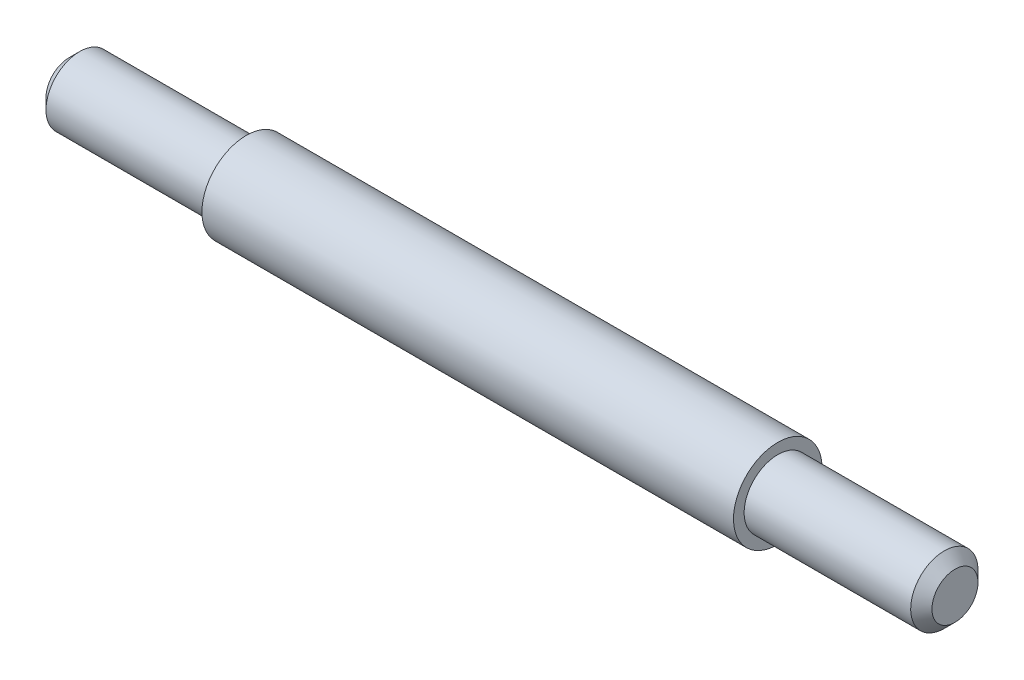
ISO-10303-21;
HEADER;
FILE_DESCRIPTION(('STEP AP214'),'2;1');
FILE_NAME('part.step','',(''),(''),'','','');
FILE_SCHEMA(('AUTOMOTIVE_DESIGN { 1 0 10303 214 1 1 1 1 }'));
ENDSEC;
DATA;
#1=APPLICATION_CONTEXT('core data for automotive mechanical design processes');
#2=APPLICATION_PROTOCOL_DEFINITION('international standard','automotive_design',2000,#1);
#3=PRODUCT_CONTEXT('',#1,'mechanical');
#4=PRODUCT('Part','Part','',(#3));
#5=PRODUCT_RELATED_PRODUCT_CATEGORY('part','',(#4));
#6=PRODUCT_DEFINITION_FORMATION('','',#4);
#7=PRODUCT_DEFINITION_CONTEXT('part definition',#1,'design');
#8=PRODUCT_DEFINITION('design','',#6,#7);
#9=PRODUCT_DEFINITION_SHAPE('','',#8);
#10=(LENGTH_UNIT() NAMED_UNIT(*) SI_UNIT(.MILLI.,.METRE.));
#11=(NAMED_UNIT(*) PLANE_ANGLE_UNIT() SI_UNIT($,.RADIAN.));
#12=(NAMED_UNIT(*) SI_UNIT($,.STERADIAN.) SOLID_ANGLE_UNIT());
#13=UNCERTAINTY_MEASURE_WITH_UNIT(LENGTH_MEASURE(1.E-05),#10,'distance_accuracy_value','');
#14=(GEOMETRIC_REPRESENTATION_CONTEXT(3) GLOBAL_UNCERTAINTY_ASSIGNED_CONTEXT((#13)) GLOBAL_UNIT_ASSIGNED_CONTEXT((#10,
#11,#12)) REPRESENTATION_CONTEXT('',''));
#15=CARTESIAN_POINT('',(0.,0.,0.));
#16=DIRECTION('',(0.,0.,1.));
#17=DIRECTION('',(1.,0.,0.));
#18=AXIS2_PLACEMENT_3D('',#15,#16,#17);
#19=CARTESIAN_POINT('',(0.75,0.125,0.));
#20=DIRECTION('',(1.,0.,0.));
#21=DIRECTION('',(0.,1.,0.));
#22=AXIS2_PLACEMENT_3D('',#19,#20,#21);
#23=PLANE('',#22);
#24=CARTESIAN_POINT('',(0.75,0.,0.));
#25=DIRECTION('',(1.,0.,0.));
#26=DIRECTION('',(0.,1.,0.));
#27=AXIS2_PLACEMENT_3D('',#24,#25,#26);
#28=CIRCLE('',#27,0.125);
#29=CARTESIAN_POINT('',(0.75,0.125,0.));
#30=VERTEX_POINT('',#29);
#31=EDGE_CURVE('E58',#30,#30,#28,.T.);
#32=ORIENTED_EDGE('',*,*,#31,.T.);
#33=EDGE_LOOP('',(#32));
#34=FACE_BOUND('',#33,.T.);
#35=CARTESIAN_POINT('',(0.75,0.,0.));
#36=DIRECTION('',(1.,0.,0.));
#37=DIRECTION('',(0.,1.,0.));
#38=AXIS2_PLACEMENT_3D('',#35,#36,#37);
#39=CIRCLE('',#38,0.0950000000000002);
#40=CARTESIAN_POINT('',(0.75,0.095,0.));
#41=VERTEX_POINT('',#40);
#42=EDGE_CURVE('E67',#41,#41,#39,.T.);
#43=ORIENTED_EDGE('',*,*,#42,.F.);
#44=EDGE_LOOP('',(#43));
#45=FACE_BOUND('',#44,.T.);
#46=ADVANCED_FACE('F37',(#34,#45),#23,.T.);
#47=CARTESIAN_POINT('',(1.25,0.,0.));
#48=DIRECTION('',(1.,0.,0.));
#49=DIRECTION('',(0.,1.,0.));
#50=AXIS2_PLACEMENT_3D('',#47,#48,#49);
#51=CYLINDRICAL_SURFACE('',#50,0.125);
#52=CARTESIAN_POINT('',(-0.75,0.,0.));
#53=DIRECTION('',(1.,0.,0.));
#54=DIRECTION('',(0.,1.,0.));
#55=AXIS2_PLACEMENT_3D('',#52,#53,#54);
#56=CIRCLE('',#55,0.125);
#57=CARTESIAN_POINT('',(-0.75,0.125,0.));
#58=VERTEX_POINT('',#57);
#59=EDGE_CURVE('E61',#58,#58,#56,.T.);
#60=ORIENTED_EDGE('',*,*,#59,.T.);
#61=EDGE_LOOP('',(#60));
#62=FACE_BOUND('',#61,.T.);
#63=ORIENTED_EDGE('',*,*,#31,.F.);
#64=EDGE_LOOP('',(#63));
#65=FACE_BOUND('',#64,.T.);
#66=ADVANCED_FACE('F74',(#62,#65),#51,.T.);
#67=CARTESIAN_POINT('',(-0.75,0.125,0.));
#68=DIRECTION('',(-1.,0.,0.));
#69=DIRECTION('',(0.,-1.,0.));
#70=AXIS2_PLACEMENT_3D('',#67,#68,#69);
#71=PLANE('',#70);
#72=CARTESIAN_POINT('',(-0.75,0.,0.));
#73=DIRECTION('',(1.,0.,0.));
#74=DIRECTION('',(0.,1.,0.));
#75=AXIS2_PLACEMENT_3D('',#72,#73,#74);
#76=CIRCLE('',#75,0.0950000000000001);
#77=CARTESIAN_POINT('',(-0.75,0.0949999999999998,0.));
#78=VERTEX_POINT('',#77);
#79=EDGE_CURVE('E64',#78,#78,#76,.T.);
#80=ORIENTED_EDGE('',*,*,#79,.T.);
#81=EDGE_LOOP('',(#80));
#82=FACE_BOUND('',#81,.T.);
#83=ORIENTED_EDGE('',*,*,#59,.F.);
#84=EDGE_LOOP('',(#83));
#85=FACE_BOUND('',#84,.T.);
#86=ADVANCED_FACE('F80',(#82,#85),#71,.T.);
#87=CARTESIAN_POINT('',(1.25,0.,0.));
#88=DIRECTION('',(1.,0.,0.));
#89=DIRECTION('',(0.,1.,0.));
#90=AXIS2_PLACEMENT_3D('',#87,#88,#89);
#91=CYLINDRICAL_SURFACE('',#90,0.0950000000000003);
#92=CARTESIAN_POINT('',(-1.22,0.,0.));
#93=DIRECTION('',(-1.,0.,0.));
#94=DIRECTION('',(0.,-1.,0.));
#95=AXIS2_PLACEMENT_3D('',#92,#93,#94);
#96=CIRCLE('',#95,0.0950000000000003);
#97=CARTESIAN_POINT('',(-1.22,-0.0950000000000005,0.));
#98=VERTEX_POINT('',#97);
#99=EDGE_CURVE('E53',#98,#98,#96,.F.);
#100=ORIENTED_EDGE('',*,*,#99,.T.);
#101=EDGE_LOOP('',(#100));
#102=FACE_BOUND('',#101,.T.);
#103=ORIENTED_EDGE('',*,*,#79,.F.);
#104=EDGE_LOOP('',(#103));
#105=FACE_BOUND('',#104,.T.);
#106=ADVANCED_FACE('F101',(#102,#105),#91,.T.);
#107=CARTESIAN_POINT('',(-1.25,0.0950000000000003,0.));
#108=DIRECTION('',(-1.,0.,0.));
#109=DIRECTION('',(0.,-1.,0.));
#110=AXIS2_PLACEMENT_3D('',#107,#108,#109);
#111=PLANE('',#110);
#112=CARTESIAN_POINT('',(-1.25,0.,0.));
#113=DIRECTION('',(-1.,0.,0.));
#114=DIRECTION('',(0.,-1.,0.));
#115=AXIS2_PLACEMENT_3D('',#112,#113,#114);
#116=CIRCLE('',#115,0.0650000000000006);
#117=CARTESIAN_POINT('',(-1.25,-0.0650000000000008,0.));
#118=VERTEX_POINT('',#117);
#119=EDGE_CURVE('E49',#118,#118,#116,.T.);
#120=ORIENTED_EDGE('',*,*,#119,.T.);
#121=EDGE_LOOP('',(#120));
#122=FACE_BOUND('',#121,.T.);
#123=ADVANCED_FACE('F104',(#122),#111,.T.);
#124=CARTESIAN_POINT('',(1.25,0.0949999999999998,0.));
#125=DIRECTION('',(1.,0.,0.));
#126=DIRECTION('',(0.,1.,0.));
#127=AXIS2_PLACEMENT_3D('',#124,#125,#126);
#128=PLANE('',#127);
#129=CARTESIAN_POINT('',(1.25,0.,0.));
#130=DIRECTION('',(1.,0.,0.));
#131=DIRECTION('',(0.,1.,0.));
#132=AXIS2_PLACEMENT_3D('',#129,#130,#131);
#133=CIRCLE('',#132,0.0649999999999995);
#134=CARTESIAN_POINT('',(1.25,0.0649999999999993,0.));
#135=VERTEX_POINT('',#134);
#136=EDGE_CURVE('E45',#135,#135,#133,.T.);
#137=ORIENTED_EDGE('',*,*,#136,.T.);
#138=EDGE_LOOP('',(#137));
#139=FACE_BOUND('',#138,.T.);
#140=ADVANCED_FACE('F95',(#139),#128,.T.);
#141=CARTESIAN_POINT('',(1.25,0.,0.));
#142=DIRECTION('',(1.,0.,0.));
#143=DIRECTION('',(0.,1.,0.));
#144=AXIS2_PLACEMENT_3D('',#141,#142,#143);
#145=CYLINDRICAL_SURFACE('',#144,0.0950000000000001);
#146=CARTESIAN_POINT('',(1.22,0.,0.));
#147=DIRECTION('',(1.,0.,0.));
#148=DIRECTION('',(0.,1.,0.));
#149=AXIS2_PLACEMENT_3D('',#146,#147,#148);
#150=CIRCLE('',#149,0.0950000000000001);
#151=CARTESIAN_POINT('',(1.22,0.0949999999999999,0.));
#152=VERTEX_POINT('',#151);
#153=EDGE_CURVE('E10',#152,#152,#150,.F.);
#154=ORIENTED_EDGE('',*,*,#153,.T.);
#155=EDGE_LOOP('',(#154));
#156=FACE_BOUND('',#155,.T.);
#157=ORIENTED_EDGE('',*,*,#42,.T.);
#158=EDGE_LOOP('',(#157));
#159=FACE_BOUND('',#158,.T.);
#160=ADVANCED_FACE('F71',(#156,#159),#145,.T.);
#161=CARTESIAN_POINT('',(-1.22,0.,0.));
#162=DIRECTION('',(1.,0.,0.));
#163=DIRECTION('',(0.,1.,0.));
#164=AXIS2_PLACEMENT_3D('',#161,#162,#163);
#165=CONICAL_SURFACE('',#164,0.0950000000000003,0.785398163397449);
#166=ORIENTED_EDGE('',*,*,#119,.F.);
#167=EDGE_LOOP('',(#166));
#168=FACE_BOUND('',#167,.T.);
#169=ORIENTED_EDGE('',*,*,#99,.F.);
#170=EDGE_LOOP('',(#169));
#171=FACE_BOUND('',#170,.T.);
#172=ADVANCED_FACE('F85',(#168,#171),#165,.T.);
#173=CARTESIAN_POINT('',(1.25,0.,0.));
#174=DIRECTION('',(-1.,0.,0.));
#175=DIRECTION('',(0.,-1.,0.));
#176=AXIS2_PLACEMENT_3D('',#173,#174,#175);
#177=CONICAL_SURFACE('',#176,0.0649999999999995,0.785398163397446);
#178=ORIENTED_EDGE('',*,*,#153,.F.);
#179=EDGE_LOOP('',(#178));
#180=FACE_BOUND('',#179,.T.);
#181=ORIENTED_EDGE('',*,*,#136,.F.);
#182=EDGE_LOOP('',(#181));
#183=FACE_BOUND('',#182,.T.);
#184=ADVANCED_FACE('F40',(#180,#183),#177,.T.);
#185=CLOSED_SHELL('',(#46,#66,#86,#106,#123,#140,#160,#172,#184));
#186=MANIFOLD_SOLID_BREP('B2',#185);
#187=ADVANCED_BREP_SHAPE_REPRESENTATION('',(#18,#186),#14);
#188=SHAPE_DEFINITION_REPRESENTATION(#9,#187);
ENDSEC;
END-ISO-10303-21;
